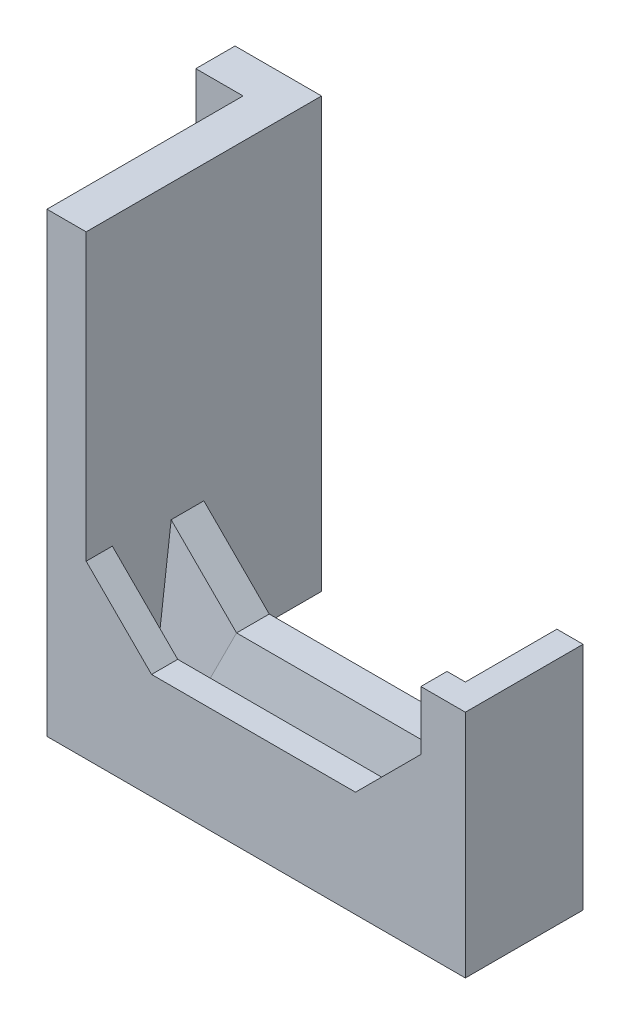
ISO-10303-21;
HEADER;
FILE_DESCRIPTION(('STEP AP214'),'2;1');
FILE_NAME('part.step','',(''),(''),'','','');
FILE_SCHEMA(('AUTOMOTIVE_DESIGN { 1 0 10303 214 1 1 1 1 }'));
ENDSEC;
DATA;
#1=APPLICATION_CONTEXT('core data for automotive mechanical design processes');
#2=APPLICATION_PROTOCOL_DEFINITION('international standard','automotive_design',2000,#1);
#3=PRODUCT_CONTEXT('',#1,'mechanical');
#4=PRODUCT('Part','Part','',(#3));
#5=PRODUCT_RELATED_PRODUCT_CATEGORY('part','',(#4));
#6=PRODUCT_DEFINITION_FORMATION('','',#4);
#7=PRODUCT_DEFINITION_CONTEXT('part definition',#1,'design');
#8=PRODUCT_DEFINITION('design','',#6,#7);
#9=PRODUCT_DEFINITION_SHAPE('','',#8);
#10=(LENGTH_UNIT() NAMED_UNIT(*) SI_UNIT(.MILLI.,.METRE.));
#11=(NAMED_UNIT(*) PLANE_ANGLE_UNIT() SI_UNIT($,.RADIAN.));
#12=(NAMED_UNIT(*) SI_UNIT($,.STERADIAN.) SOLID_ANGLE_UNIT());
#13=UNCERTAINTY_MEASURE_WITH_UNIT(LENGTH_MEASURE(1.E-05),#10,'distance_accuracy_value','');
#14=(GEOMETRIC_REPRESENTATION_CONTEXT(3) GLOBAL_UNCERTAINTY_ASSIGNED_CONTEXT((#13)) GLOBAL_UNIT_ASSIGNED_CONTEXT((#10,
#11,#12)) REPRESENTATION_CONTEXT('',''));
#15=CARTESIAN_POINT('',(0.,0.,0.));
#16=DIRECTION('',(0.,0.,1.));
#17=DIRECTION('',(1.,0.,0.));
#18=AXIS2_PLACEMENT_3D('',#15,#16,#17);
#19=CARTESIAN_POINT('',(13.8973299123179,86.3847199439034,18.));
#20=DIRECTION('',(0.,-1.,0.));
#21=DIRECTION('',(1.,0.,0.));
#22=AXIS2_PLACEMENT_3D('',#19,#20,#21);
#23=PLANE('',#22);
#24=DIRECTION('',(-1.,0.,0.));
#25=VECTOR('',#24,1.);
#26=CARTESIAN_POINT('',(13.8973299123179,86.3847199439034,18.));
#27=LINE('',#26,#25);
#28=CARTESIAN_POINT('',(5.49412361691209,86.3847199439034,18.));
#29=VERTEX_POINT('',#28);
#30=CARTESIAN_POINT('',(-10.1026700876821,86.3847199439034,18.));
#31=VERTEX_POINT('',#30);
#32=EDGE_CURVE('E280',#29,#31,#27,.T.);
#33=ORIENTED_EDGE('',*,*,#32,.F.);
#34=DIRECTION('',(0.,0.,-1.));
#35=VECTOR('',#34,1.);
#36=CARTESIAN_POINT('',(5.49412361691209,86.3847199439034,16.));
#37=LINE('',#36,#35);
#38=CARTESIAN_POINT('',(5.49412361691209,86.3847199439034,16.));
#39=VERTEX_POINT('',#38);
#40=EDGE_CURVE('E405',#29,#39,#37,.T.);
#41=ORIENTED_EDGE('',*,*,#40,.T.);
#42=DIRECTION('',(-1.,0.,0.));
#43=VECTOR('',#42,1.);
#44=CARTESIAN_POINT('',(13.8973299123179,86.3847199439034,16.));
#45=LINE('',#44,#43);
#46=CARTESIAN_POINT('',(-10.1026700876821,86.3847199439034,16.));
#47=VERTEX_POINT('',#46);
#48=EDGE_CURVE('E283',#39,#47,#45,.T.);
#49=ORIENTED_EDGE('',*,*,#48,.T.);
#50=DIRECTION('',(0.,0.,1.));
#51=VECTOR('',#50,1.);
#52=CARTESIAN_POINT('',(-10.1026700876821,86.3847199439034,18.));
#53=LINE('',#52,#51);
#54=EDGE_CURVE('E383',#47,#31,#53,.T.);
#55=ORIENTED_EDGE('',*,*,#54,.T.);
#56=EDGE_LOOP('',(#33,#41,#49,#55));
#57=FACE_BOUND('',#56,.T.);
#58=ADVANCED_FACE('F36',(#57),#23,.F.);
#59=CARTESIAN_POINT('',(-15.1026700876821,80.3847199439034,3.));
#60=DIRECTION('',(-1.,0.,0.));
#61=DIRECTION('',(0.,-1.,0.));
#62=AXIS2_PLACEMENT_3D('',#59,#60,#61);
#63=PLANE('',#62);
#64=DIRECTION('',(0.,0.,-1.));
#65=VECTOR('',#64,1.);
#66=CARTESIAN_POINT('',(-15.1026700876821,80.3847199439034,3.));
#67=LINE('',#66,#65);
#68=CARTESIAN_POINT('',(-15.1026700876821,80.3847199439033,16.));
#69=VERTEX_POINT('',#68);
#70=CARTESIAN_POINT('',(-15.1026700876821,80.3847199439033,12.8091610395335));
#71=VERTEX_POINT('',#70);
#72=EDGE_CURVE('E375',#69,#71,#67,.T.);
#73=ORIENTED_EDGE('',*,*,#72,.T.);
#74=DIRECTION('',(0.,0.992316665359131,-0.123724030206482));
#75=VECTOR('',#74,1.);
#76=CARTESIAN_POINT('',(-15.1026700876821,81.5890241634079,12.6590059763029));
#77=LINE('',#76,#75);
#78=CARTESIAN_POINT('',(-15.1026700876821,90.8847199439033,11.4999999999999));
#79=VERTEX_POINT('',#78);
#80=EDGE_CURVE('E425',#71,#79,#77,.T.);
#81=ORIENTED_EDGE('',*,*,#80,.T.);
#82=DIRECTION('',(0.,0.,-1.));
#83=VECTOR('',#82,1.);
#84=CARTESIAN_POINT('',(-15.1026700876821,90.8847199439033,8.99999999999998));
#85=LINE('',#84,#83);
#86=CARTESIAN_POINT('',(-15.1026700876821,90.8847199439033,8.99999999999998));
#87=VERTEX_POINT('',#86);
#88=EDGE_CURVE('E397',#79,#87,#85,.T.);
#89=ORIENTED_EDGE('',*,*,#88,.T.);
#90=DIRECTION('',(0.,-1.,0.));
#91=VECTOR('',#90,1.);
#92=CARTESIAN_POINT('',(-15.1026700876821,85.8847199439034,8.99999999999998));
#93=LINE('',#92,#91);
#94=CARTESIAN_POINT('',(-15.1026700876821,80.3847199439033,8.99999999999998));
#95=VERTEX_POINT('',#94);
#96=EDGE_CURVE('E261',#87,#95,#93,.T.);
#97=ORIENTED_EDGE('',*,*,#96,.T.);
#98=CARTESIAN_POINT('',(-15.1026700876821,80.3847199439034,0.));
#99=VERTEX_POINT('',#98);
#100=EDGE_CURVE('E374',#95,#99,#67,.T.);
#101=ORIENTED_EDGE('',*,*,#100,.T.);
#102=DIRECTION('',(0.,1.,0.));
#103=VECTOR('',#102,1.);
#104=CARTESIAN_POINT('',(-15.1026700876821,80.3847199439034,0.));
#105=LINE('',#104,#103);
#106=CARTESIAN_POINT('',(-15.1026700876821,113.200215401418,0.));
#107=VERTEX_POINT('',#106);
#108=EDGE_CURVE('E340',#99,#107,#105,.T.);
#109=ORIENTED_EDGE('',*,*,#108,.T.);
#110=DIRECTION('',(0.,0.,-1.));
#111=VECTOR('',#110,1.);
#112=CARTESIAN_POINT('',(-15.1026700876821,113.200215401418,3.));
#113=LINE('',#112,#111);
#114=CARTESIAN_POINT('',(-15.1026700876821,113.200215401418,18.));
#115=VERTEX_POINT('',#114);
#116=EDGE_CURVE('E371',#115,#107,#113,.T.);
#117=ORIENTED_EDGE('',*,*,#116,.F.);
#118=DIRECTION('',(0.,1.,0.));
#119=VECTOR('',#118,1.);
#120=CARTESIAN_POINT('',(-15.1026700876821,113.200215401418,18.));
#121=LINE('',#120,#119);
#122=CARTESIAN_POINT('',(-15.1026700876821,91.3847199439034,18.));
#123=VERTEX_POINT('',#122);
#124=EDGE_CURVE('E286',#123,#115,#121,.T.);
#125=ORIENTED_EDGE('',*,*,#124,.F.);
#126=DIRECTION('',(0.,0.,-1.));
#127=VECTOR('',#126,1.);
#128=CARTESIAN_POINT('',(-15.1026700876821,91.3847199439034,16.));
#129=LINE('',#128,#127);
#130=CARTESIAN_POINT('',(-15.1026700876821,91.3847199439034,16.));
#131=VERTEX_POINT('',#130);
#132=EDGE_CURVE('E386',#123,#131,#129,.T.);
#133=ORIENTED_EDGE('',*,*,#132,.T.);
#134=DIRECTION('',(0.,1.,0.));
#135=VECTOR('',#134,1.);
#136=CARTESIAN_POINT('',(-15.1026700876821,80.3847199439034,16.));
#137=LINE('',#136,#135);
#138=EDGE_CURVE('E277',#69,#131,#137,.T.);
#139=ORIENTED_EDGE('',*,*,#138,.F.);
#140=EDGE_LOOP('',(#73,#81,#89,#97,#101,#109,#117,#125,#133,#139));
#141=FACE_BOUND('',#140,.T.);
#142=ADVANCED_FACE('F456',(#141),#63,.F.);
#143=CARTESIAN_POINT('',(11.8973299123179,86.3847199439034,8.99999999999998));
#144=DIRECTION('',(1.,0.,0.));
#145=DIRECTION('',(0.,0.,-1.));
#146=AXIS2_PLACEMENT_3D('',#143,#144,#145);
#147=PLANE('',#146);
#148=DIRECTION('',(0.,1.,0.));
#149=VECTOR('',#148,1.);
#150=CARTESIAN_POINT('',(11.8973299123179,86.3847199439034,8.99999999999998));
#151=LINE('',#150,#149);
#152=CARTESIAN_POINT('',(11.8973299123179,88.8847199439033,8.99999999999998));
#153=VERTEX_POINT('',#152);
#154=CARTESIAN_POINT('',(11.8973299123179,95.8847199439033,8.99999999999998));
#155=VERTEX_POINT('',#154);
#156=EDGE_CURVE('E226',#153,#155,#151,.T.);
#157=ORIENTED_EDGE('',*,*,#156,.F.);
#158=DIRECTION('',(0.,0.,1.));
#159=VECTOR('',#158,1.);
#160=CARTESIAN_POINT('',(11.8973299123179,88.8847199439033,13.5));
#161=LINE('',#160,#159);
#162=CARTESIAN_POINT('',(11.8973299123179,88.8847199439033,11.4999999999999));
#163=VERTEX_POINT('',#162);
#164=EDGE_CURVE('E413',#153,#163,#161,.T.);
#165=ORIENTED_EDGE('',*,*,#164,.T.);
#166=DIRECTION('',(0.,-0.992316665359131,0.123724030206482));
#167=VECTOR('',#166,1.);
#168=CARTESIAN_POINT('',(11.8973299123179,86.7299225757279,11.7686644535718));
#169=LINE('',#168,#167);
#170=CARTESIAN_POINT('',(11.8973299123179,80.3847199439033,12.5597970320033));
#171=VERTEX_POINT('',#170);
#172=EDGE_CURVE('E47',#163,#171,#169,.T.);
#173=ORIENTED_EDGE('',*,*,#172,.T.);
#174=DIRECTION('',(0.,0.,1.));
#175=VECTOR('',#174,1.);
#176=CARTESIAN_POINT('',(11.8973299123179,80.3847199439033,8.99999999999998));
#177=LINE('',#176,#175);
#178=CARTESIAN_POINT('',(11.8973299123179,80.3847199439033,16.));
#179=VERTEX_POINT('',#178);
#180=EDGE_CURVE('E53',#171,#179,#177,.T.);
#181=ORIENTED_EDGE('',*,*,#180,.T.);
#182=DIRECTION('',(0.,1.,0.));
#183=VECTOR('',#182,1.);
#184=CARTESIAN_POINT('',(11.8973299123179,86.3847199439034,16.));
#185=LINE('',#184,#183);
#186=CARTESIAN_POINT('',(11.8973299123179,95.8847199439033,16.));
#187=VERTEX_POINT('',#186);
#188=EDGE_CURVE('E227',#179,#187,#185,.T.);
#189=ORIENTED_EDGE('',*,*,#188,.T.);
#190=DIRECTION('',(0.,0.,1.));
#191=VECTOR('',#190,1.);
#192=CARTESIAN_POINT('',(11.8973299123179,95.8847199439033,8.99999999999998));
#193=LINE('',#192,#191);
#194=EDGE_CURVE('E237',#155,#187,#193,.T.);
#195=ORIENTED_EDGE('',*,*,#194,.F.);
#196=EDGE_LOOP('',(#157,#165,#173,#181,#189,#195));
#197=FACE_BOUND('',#196,.T.);
#198=ADVANCED_FACE('F468',(#197),#147,.F.);
#199=CARTESIAN_POINT('',(13.8973299123179,80.3847199439033,8.99999999999998));
#200=DIRECTION('',(0.,-1.,0.));
#201=DIRECTION('',(0.,0.,-1.));
#202=AXIS2_PLACEMENT_3D('',#199,#200,#201);
#203=PLANE('',#202);
#204=ORIENTED_EDGE('',*,*,#180,.F.);
#205=DIRECTION('',(-0.992316665359131,0.,-0.12372403020648));
#206=VECTOR('',#205,1.);
#207=CARTESIAN_POINT('',(13.4296661952891,80.3847199439033,12.7508517902061));
#208=LINE('',#207,#206);
#209=CARTESIAN_POINT('',(11.1755045053699,80.3847199439033,12.4697983938964));
#210=VERTEX_POINT('',#209);
#211=EDGE_CURVE('E11',#171,#210,#208,.T.);
#212=ORIENTED_EDGE('',*,*,#211,.T.);
#213=DIRECTION('',(1.,0.,0.));
#214=VECTOR('',#213,1.);
#215=CARTESIAN_POINT('',(13.8973299123179,80.3847199439033,12.4697983938964));
#216=LINE('',#215,#214);
#217=CARTESIAN_POINT('',(-12.3808446807341,80.3847199439033,12.4697983938965));
#218=VERTEX_POINT('',#217);
#219=EDGE_CURVE('E430',#210,#218,#216,.F.);
#220=ORIENTED_EDGE('',*,*,#219,.T.);
#221=DIRECTION('',(-0.992316665359131,0.,0.123724030206481));
#222=VECTOR('',#221,1.);
#223=CARTESIAN_POINT('',(13.9210721954812,80.3847199439033,9.19042269490677));
#224=LINE('',#223,#222);
#225=EDGE_CURVE('E427',#218,#71,#224,.T.);
#226=ORIENTED_EDGE('',*,*,#225,.T.);
#227=ORIENTED_EDGE('',*,*,#72,.F.);
#228=DIRECTION('',(1.,0.,0.));
#229=VECTOR('',#228,1.);
#230=CARTESIAN_POINT('',(13.8973299123179,80.3847199439033,16.));
#231=LINE('',#230,#229);
#232=EDGE_CURVE('E263',#69,#179,#231,.T.);
#233=ORIENTED_EDGE('',*,*,#232,.T.);
#234=EDGE_LOOP('',(#204,#212,#220,#226,#227,#233));
#235=FACE_BOUND('',#234,.T.);
#236=ADVANCED_FACE('F459',(#235),#203,.F.);
#237=CARTESIAN_POINT('',(-22.3449721572885,75.3032487766021,3.));
#238=DIRECTION('',(-0.574361670342173,0.81860165626619,0.));
#239=DIRECTION('',(-0.81860165626619,-0.574361670342173,0.));
#240=AXIS2_PLACEMENT_3D('',#237,#238,#239);
#241=PLANE('',#240);
#242=DIRECTION('',(0.81860165626619,0.574361670342173,0.));
#243=VECTOR('',#242,1.);
#244=CARTESIAN_POINT('',(-22.3449721572885,75.3032487766021,8.99999999999998));
#245=LINE('',#244,#243);
#246=CARTESIAN_POINT('',(-18.1026700876821,78.2798072579386,8.99999999999998));
#247=VERTEX_POINT('',#246);
#248=EDGE_CURVE('E266',#247,#95,#245,.T.);
#249=ORIENTED_EDGE('',*,*,#248,.F.);
#250=DIRECTION('',(0.,0.,-1.));
#251=VECTOR('',#250,1.);
#252=CARTESIAN_POINT('',(-18.1026700876821,78.2798072579386,18.));
#253=LINE('',#252,#251);
#254=CARTESIAN_POINT('',(-18.1026700876821,78.2798072579386,3.));
#255=VERTEX_POINT('',#254);
#256=EDGE_CURVE('E292',#247,#255,#253,.T.);
#257=ORIENTED_EDGE('',*,*,#256,.T.);
#258=DIRECTION('',(0.81860165626619,0.574361670342173,0.));
#259=VECTOR('',#258,1.);
#260=CARTESIAN_POINT('',(-22.3449721572885,75.3032487766021,3.));
#261=LINE('',#260,#259);
#262=CARTESIAN_POINT('',(-22.3449721572885,75.3032487766021,3.));
#263=VERTEX_POINT('',#262);
#264=EDGE_CURVE('E318',#263,#255,#261,.T.);
#265=ORIENTED_EDGE('',*,*,#264,.F.);
#266=DIRECTION('',(0.,0.,-1.));
#267=VECTOR('',#266,1.);
#268=CARTESIAN_POINT('',(-22.3449721572885,75.3032487766021,3.));
#269=LINE('',#268,#267);
#270=CARTESIAN_POINT('',(-22.3449721572885,75.3032487766021,0.));
#271=VERTEX_POINT('',#270);
#272=EDGE_CURVE('E377',#263,#271,#269,.T.);
#273=ORIENTED_EDGE('',*,*,#272,.T.);
#274=DIRECTION('',(0.81860165626619,0.574361670342173,0.));
#275=VECTOR('',#274,1.);
#276=CARTESIAN_POINT('',(-22.3449721572885,75.3032487766021,0.));
#277=LINE('',#276,#275);
#278=EDGE_CURVE('E337',#271,#99,#277,.T.);
#279=ORIENTED_EDGE('',*,*,#278,.T.);
#280=ORIENTED_EDGE('',*,*,#100,.F.);
#281=EDGE_LOOP('',(#249,#257,#265,#273,#279,#280));
#282=FACE_BOUND('',#281,.T.);
#283=ADVANCED_FACE('F489',(#282),#241,.F.);
#284=CARTESIAN_POINT('',(13.8973299123179,80.3847199439033,16.));
#285=DIRECTION('',(0.,0.,1.));
#286=DIRECTION('',(1.,0.,0.));
#287=AXIS2_PLACEMENT_3D('',#284,#285,#286);
#288=PLANE('',#287);
#289=ORIENTED_EDGE('',*,*,#232,.F.);
#290=ORIENTED_EDGE('',*,*,#138,.T.);
#291=DIRECTION('',(-0.70710678118655,0.707106781186545,0.));
#292=VECTOR('',#291,1.);
#293=CARTESIAN_POINT('',(4.897329912318,71.3847199439034,16.));
#294=LINE('',#293,#292);
#295=EDGE_CURVE('E391',#131,#47,#294,.F.);
#296=ORIENTED_EDGE('',*,*,#295,.T.);
#297=ORIENTED_EDGE('',*,*,#48,.F.);
#298=DIRECTION('',(-0.707106781186545,-0.70710678118655,0.));
#299=VECTOR('',#298,1.);
#300=CARTESIAN_POINT('',(6.69572676461494,87.5863230916062,16.));
#301=LINE('',#300,#299);
#302=CARTESIAN_POINT('',(10.4941236169121,91.3847199439034,16.));
#303=VERTEX_POINT('',#302);
#304=EDGE_CURVE('E409',#39,#303,#301,.F.);
#305=ORIENTED_EDGE('',*,*,#304,.T.);
#306=DIRECTION('',(0.,-1.,0.));
#307=VECTOR('',#306,1.);
#308=CARTESIAN_POINT('',(10.4941236169121,95.8847199439033,16.));
#309=LINE('',#308,#307);
#310=CARTESIAN_POINT('',(10.4941236169121,95.8847199439033,16.));
#311=VERTEX_POINT('',#310);
#312=EDGE_CURVE('E256',#311,#303,#309,.T.);
#313=ORIENTED_EDGE('',*,*,#312,.F.);
#314=DIRECTION('',(-1.,0.,0.));
#315=VECTOR('',#314,1.);
#316=CARTESIAN_POINT('',(10.4941236169121,95.8847199439033,16.));
#317=LINE('',#316,#315);
#318=EDGE_CURVE('E248',#187,#311,#317,.T.);
#319=ORIENTED_EDGE('',*,*,#318,.F.);
#320=ORIENTED_EDGE('',*,*,#188,.F.);
#321=EDGE_LOOP('',(#289,#290,#296,#297,#305,#313,#319,#320));
#322=FACE_BOUND('',#321,.T.);
#323=ADVANCED_FACE('F473',(#322),#288,.F.);
#324=CARTESIAN_POINT('',(-25.7628879169966,78.9526119894845,3.));
#325=DIRECTION('',(0.,0.,1.));
#326=DIRECTION('',(1.,0.,0.));
#327=AXIS2_PLACEMENT_3D('',#324,#325,#326);
#328=PLANE('',#327);
#329=DIRECTION('',(0.,-1.,0.));
#330=VECTOR('',#329,1.);
#331=CARTESIAN_POINT('',(-18.1026700876821,80.3847199439034,3.));
#332=LINE('',#331,#330);
#333=CARTESIAN_POINT('',(-18.1026700876821,113.200215401418,3.));
#334=VERTEX_POINT('',#333);
#335=EDGE_CURVE('E285',#334,#255,#332,.T.);
#336=ORIENTED_EDGE('',*,*,#335,.F.);
#337=DIRECTION('',(-1.,0.,0.));
#338=VECTOR('',#337,1.);
#339=CARTESIAN_POINT('',(-15.1026700876821,113.200215401418,3.));
#340=LINE('',#339,#338);
#341=CARTESIAN_POINT('',(-21.7189991465302,113.200215401418,3.));
#342=VERTEX_POINT('',#341);
#343=EDGE_CURVE('E321',#334,#342,#340,.T.);
#344=ORIENTED_EDGE('',*,*,#343,.T.);
#345=DIRECTION('',(0.,-1.,0.));
#346=VECTOR('',#345,1.);
#347=CARTESIAN_POINT('',(-21.7189991465302,113.200215401418,3.));
#348=LINE('',#347,#346);
#349=CARTESIAN_POINT('',(-21.7189991465302,103.843357559284,3.));
#350=VERTEX_POINT('',#349);
#351=EDGE_CURVE('E323',#342,#350,#348,.T.);
#352=ORIENTED_EDGE('',*,*,#351,.T.);
#353=CARTESIAN_POINT('',(-25.7628879169966,103.843357559284,3.));
#354=DIRECTION('',(0.,0.,-1.));
#355=DIRECTION('',(-1.,0.,0.));
#356=AXIS2_PLACEMENT_3D('',#353,#354,#355);
#357=CIRCLE('',#356,4.04388877046631);
#358=CARTESIAN_POINT('',(-25.7628879169966,99.7994687888175,3.));
#359=VERTEX_POINT('',#358);
#360=EDGE_CURVE('E325',#350,#359,#357,.T.);
#361=ORIENTED_EDGE('',*,*,#360,.T.);
#362=DIRECTION('',(-1.,0.,0.));
#363=VECTOR('',#362,1.);
#364=CARTESIAN_POINT('',(-25.7628879169966,99.7994687888175,3.));
#365=LINE('',#364,#363);
#366=CARTESIAN_POINT('',(-29.1744826102425,99.7994687888175,3.));
#367=VERTEX_POINT('',#366);
#368=EDGE_CURVE('E327',#359,#367,#365,.T.);
#369=ORIENTED_EDGE('',*,*,#368,.T.);
#370=DIRECTION('',(0.,-1.,0.));
#371=VECTOR('',#370,1.);
#372=CARTESIAN_POINT('',(-29.1744826102425,99.7994687888175,3.));
#373=LINE('',#372,#371);
#374=CARTESIAN_POINT('',(-29.1744826102425,97.1022234577408,3.));
#375=VERTEX_POINT('',#374);
#376=EDGE_CURVE('E329',#367,#375,#373,.T.);
#377=ORIENTED_EDGE('',*,*,#376,.T.);
#378=DIRECTION('',(-1.,0.,0.));
#379=VECTOR('',#378,1.);
#380=CARTESIAN_POINT('',(-29.1744826102425,97.1022234577408,3.));
#381=LINE('',#380,#379);
#382=CARTESIAN_POINT('',(-30.7628879169966,97.1022234577408,3.));
#383=VERTEX_POINT('',#382);
#384=EDGE_CURVE('E331',#375,#383,#381,.T.);
#385=ORIENTED_EDGE('',*,*,#384,.T.);
#386=DIRECTION('',(0.,-1.,0.));
#387=VECTOR('',#386,1.);
#388=CARTESIAN_POINT('',(-30.7628879169966,97.1022234577408,3.));
#389=LINE('',#388,#387);
#390=CARTESIAN_POINT('',(-30.7628879169966,78.9526119894845,3.));
#391=VERTEX_POINT('',#390);
#392=EDGE_CURVE('E313',#383,#391,#389,.T.);
#393=ORIENTED_EDGE('',*,*,#392,.T.);
#394=CARTESIAN_POINT('',(-25.7628879169966,78.9526119894845,3.));
#395=DIRECTION('',(0.,0.,1.));
#396=DIRECTION('',(1.,0.,0.));
#397=AXIS2_PLACEMENT_3D('',#394,#395,#396);
#398=CIRCLE('',#397,5.);
#399=EDGE_CURVE('E315',#391,#263,#398,.T.);
#400=ORIENTED_EDGE('',*,*,#399,.T.);
#401=ORIENTED_EDGE('',*,*,#264,.T.);
#402=EDGE_LOOP('',(#336,#344,#352,#361,#369,#377,#385,#393,#400,#401));
#403=FACE_BOUND('',#402,.T.);
#404=CARTESIAN_POINT('',(-25.7628879169966,88.9526119894845,3.));
#405=DIRECTION('',(0.,0.,1.));
#406=DIRECTION('',(1.,0.,0.));
#407=AXIS2_PLACEMENT_3D('',#404,#405,#406);
#408=CIRCLE('',#407,1.99999999999999);
#409=CARTESIAN_POINT('',(-23.7628879169966,88.9526119894845,3.));
#410=VERTEX_POINT('',#409);
#411=EDGE_CURVE('E307',#410,#410,#408,.T.);
#412=ORIENTED_EDGE('',*,*,#411,.F.);
#413=EDGE_LOOP('',(#412));
#414=FACE_BOUND('',#413,.T.);
#415=CARTESIAN_POINT('',(-25.7628879169966,78.9526119894845,3.));
#416=DIRECTION('',(0.,0.,1.));
#417=DIRECTION('',(1.,0.,0.));
#418=AXIS2_PLACEMENT_3D('',#415,#416,#417);
#419=CIRCLE('',#418,2.);
#420=CARTESIAN_POINT('',(-23.7628879169966,78.9526119894845,3.));
#421=VERTEX_POINT('',#420);
#422=EDGE_CURVE('E301',#421,#421,#419,.T.);
#423=ORIENTED_EDGE('',*,*,#422,.F.);
#424=EDGE_LOOP('',(#423));
#425=FACE_BOUND('',#424,.T.);
#426=ADVANCED_FACE('F497',(#403,#414,#425),#328,.T.);
#427=CARTESIAN_POINT('',(-25.7628879169966,78.9526119894845,0.));
#428=DIRECTION('',(0.,0.,1.));
#429=DIRECTION('',(1.,0.,0.));
#430=AXIS2_PLACEMENT_3D('',#427,#428,#429);
#431=PLANE('',#430);
#432=DIRECTION('',(0.,-1.,0.));
#433=VECTOR('',#432,1.);
#434=CARTESIAN_POINT('',(-30.7628879169966,88.9526119894845,0.));
#435=LINE('',#434,#433);
#436=CARTESIAN_POINT('',(-30.7628879169966,97.1022234577408,0.));
#437=VERTEX_POINT('',#436);
#438=CARTESIAN_POINT('',(-30.7628879169966,78.9526119894845,0.));
#439=VERTEX_POINT('',#438);
#440=EDGE_CURVE('E310',#437,#439,#435,.T.);
#441=ORIENTED_EDGE('',*,*,#440,.F.);
#442=DIRECTION('',(-1.,0.,0.));
#443=VECTOR('',#442,1.);
#444=CARTESIAN_POINT('',(-29.1744826102425,97.1022234577408,0.));
#445=LINE('',#444,#443);
#446=CARTESIAN_POINT('',(-29.1744826102425,97.1022234577408,0.));
#447=VERTEX_POINT('',#446);
#448=EDGE_CURVE('E316',#447,#437,#445,.T.);
#449=ORIENTED_EDGE('',*,*,#448,.F.);
#450=DIRECTION('',(0.,-1.,0.));
#451=VECTOR('',#450,1.);
#452=CARTESIAN_POINT('',(-29.1744826102425,99.7994687888175,0.));
#453=LINE('',#452,#451);
#454=CARTESIAN_POINT('',(-29.1744826102425,99.7994687888175,0.));
#455=VERTEX_POINT('',#454);
#456=EDGE_CURVE('E350',#455,#447,#453,.T.);
#457=ORIENTED_EDGE('',*,*,#456,.F.);
#458=DIRECTION('',(-1.,0.,0.));
#459=VECTOR('',#458,1.);
#460=CARTESIAN_POINT('',(-25.7628879169966,99.7994687888175,0.));
#461=LINE('',#460,#459);
#462=CARTESIAN_POINT('',(-25.7628879169966,99.7994687888175,0.));
#463=VERTEX_POINT('',#462);
#464=EDGE_CURVE('E348',#463,#455,#461,.T.);
#465=ORIENTED_EDGE('',*,*,#464,.F.);
#466=CARTESIAN_POINT('',(-25.7628879169966,103.843357559284,0.));
#467=DIRECTION('',(0.,0.,-1.));
#468=DIRECTION('',(-1.,0.,0.));
#469=AXIS2_PLACEMENT_3D('',#466,#467,#468);
#470=CIRCLE('',#469,4.04388877046631);
#471=CARTESIAN_POINT('',(-21.7189991465302,103.843357559284,0.));
#472=VERTEX_POINT('',#471);
#473=EDGE_CURVE('E346',#472,#463,#470,.T.);
#474=ORIENTED_EDGE('',*,*,#473,.F.);
#475=DIRECTION('',(0.,-1.,0.));
#476=VECTOR('',#475,1.);
#477=CARTESIAN_POINT('',(-21.7189991465302,113.200215401418,0.));
#478=LINE('',#477,#476);
#479=CARTESIAN_POINT('',(-21.7189991465302,113.200215401418,0.));
#480=VERTEX_POINT('',#479);
#481=EDGE_CURVE('E344',#480,#472,#478,.T.);
#482=ORIENTED_EDGE('',*,*,#481,.F.);
#483=DIRECTION('',(-1.,0.,0.));
#484=VECTOR('',#483,1.);
#485=CARTESIAN_POINT('',(-15.1026700876821,113.200215401418,0.));
#486=LINE('',#485,#484);
#487=EDGE_CURVE('E342',#107,#480,#486,.T.);
#488=ORIENTED_EDGE('',*,*,#487,.F.);
#489=ORIENTED_EDGE('',*,*,#108,.F.);
#490=ORIENTED_EDGE('',*,*,#278,.F.);
#491=CARTESIAN_POINT('',(-25.7628879169966,78.9526119894845,0.));
#492=DIRECTION('',(0.,0.,1.));
#493=DIRECTION('',(1.,0.,0.));
#494=AXIS2_PLACEMENT_3D('',#491,#492,#493);
#495=CIRCLE('',#494,5.);
#496=EDGE_CURVE('E335',#439,#271,#495,.T.);
#497=ORIENTED_EDGE('',*,*,#496,.F.);
#498=EDGE_LOOP('',(#441,#449,#457,#465,#474,#482,#488,#489,#490,#497));
#499=FACE_BOUND('',#498,.T.);
#500=CARTESIAN_POINT('',(-25.7628879169966,88.9526119894845,0.));
#501=DIRECTION('',(0.,0.,1.));
#502=DIRECTION('',(1.,0.,0.));
#503=AXIS2_PLACEMENT_3D('',#500,#501,#502);
#504=CIRCLE('',#503,1.99999999999999);
#505=CARTESIAN_POINT('',(-23.7628879169966,88.9526119894845,0.));
#506=VERTEX_POINT('',#505);
#507=EDGE_CURVE('E304',#506,#506,#504,.T.);
#508=ORIENTED_EDGE('',*,*,#507,.T.);
#509=EDGE_LOOP('',(#508));
#510=FACE_BOUND('',#509,.T.);
#511=CARTESIAN_POINT('',(-25.7628879169966,78.9526119894845,0.));
#512=DIRECTION('',(0.,0.,1.));
#513=DIRECTION('',(1.,0.,0.));
#514=AXIS2_PLACEMENT_3D('',#511,#512,#513);
#515=CIRCLE('',#514,2.);
#516=CARTESIAN_POINT('',(-23.7628879169966,78.9526119894845,0.));
#517=VERTEX_POINT('',#516);
#518=EDGE_CURVE('E300',#517,#517,#515,.T.);
#519=ORIENTED_EDGE('',*,*,#518,.T.);
#520=EDGE_LOOP('',(#519));
#521=FACE_BOUND('',#520,.T.);
#522=ADVANCED_FACE('F541',(#499,#510,#521),#431,.F.);
#523=CARTESIAN_POINT('',(-30.7628879169966,88.9526119894845,3.));
#524=DIRECTION('',(1.,0.,0.));
#525=DIRECTION('',(0.,0.,-1.));
#526=AXIS2_PLACEMENT_3D('',#523,#524,#525);
#527=PLANE('',#526);
#528=ORIENTED_EDGE('',*,*,#440,.T.);
#529=DIRECTION('',(0.,0.,-1.));
#530=VECTOR('',#529,1.);
#531=CARTESIAN_POINT('',(-30.7628879169966,78.9526119894845,3.));
#532=LINE('',#531,#530);
#533=EDGE_CURVE('E380',#391,#439,#532,.T.);
#534=ORIENTED_EDGE('',*,*,#533,.F.);
#535=ORIENTED_EDGE('',*,*,#392,.F.);
#536=DIRECTION('',(0.,0.,-1.));
#537=VECTOR('',#536,1.);
#538=CARTESIAN_POINT('',(-30.7628879169966,97.1022234577408,3.));
#539=LINE('',#538,#537);
#540=EDGE_CURVE('E333',#383,#437,#539,.T.);
#541=ORIENTED_EDGE('',*,*,#540,.T.);
#542=EDGE_LOOP('',(#528,#534,#535,#541));
#543=FACE_BOUND('',#542,.T.);
#544=ADVANCED_FACE('F532',(#543),#527,.F.);
#545=CARTESIAN_POINT('',(-25.7628879169966,78.9526119894845,3.));
#546=DIRECTION('',(0.,0.,-1.));
#547=DIRECTION('',(-1.,0.,0.));
#548=AXIS2_PLACEMENT_3D('',#545,#546,#547);
#549=CYLINDRICAL_SURFACE('',#548,5.);
#550=ORIENTED_EDGE('',*,*,#496,.T.);
#551=ORIENTED_EDGE('',*,*,#272,.F.);
#552=ORIENTED_EDGE('',*,*,#399,.F.);
#553=ORIENTED_EDGE('',*,*,#533,.T.);
#554=EDGE_LOOP('',(#550,#551,#552,#553));
#555=FACE_BOUND('',#554,.T.);
#556=ADVANCED_FACE('F537',(#555),#549,.T.);
#557=CARTESIAN_POINT('',(-15.1026700876821,113.200215401418,3.));
#558=DIRECTION('',(0.,-1.,0.));
#559=DIRECTION('',(0.,0.,-1.));
#560=AXIS2_PLACEMENT_3D('',#557,#558,#559);
#561=PLANE('',#560);
#562=ORIENTED_EDGE('',*,*,#487,.T.);
#563=DIRECTION('',(0.,0.,-1.));
#564=VECTOR('',#563,1.);
#565=CARTESIAN_POINT('',(-21.7189991465302,113.200215401418,3.));
#566=LINE('',#565,#564);
#567=EDGE_CURVE('E368',#342,#480,#566,.T.);
#568=ORIENTED_EDGE('',*,*,#567,.F.);
#569=ORIENTED_EDGE('',*,*,#343,.F.);
#570=DIRECTION('',(0.,0.,-1.));
#571=VECTOR('',#570,1.);
#572=CARTESIAN_POINT('',(-18.1026700876821,113.200215401418,18.));
#573=LINE('',#572,#571);
#574=CARTESIAN_POINT('',(-18.1026700876821,113.200215401418,18.));
#575=VERTEX_POINT('',#574);
#576=EDGE_CURVE('E297',#575,#334,#573,.T.);
#577=ORIENTED_EDGE('',*,*,#576,.F.);
#578=DIRECTION('',(-1.,0.,0.));
#579=VECTOR('',#578,1.);
#580=CARTESIAN_POINT('',(-15.1026700876821,113.200215401418,18.));
#581=LINE('',#580,#579);
#582=EDGE_CURVE('E288',#115,#575,#581,.T.);
#583=ORIENTED_EDGE('',*,*,#582,.F.);
#584=ORIENTED_EDGE('',*,*,#116,.T.);
#585=EDGE_LOOP('',(#562,#568,#569,#577,#583,#584));
#586=FACE_BOUND('',#585,.T.);
#587=ADVANCED_FACE('F501',(#586),#561,.F.);
#588=CARTESIAN_POINT('',(-21.7189991465302,113.200215401418,3.));
#589=DIRECTION('',(1.,0.,0.));
#590=DIRECTION('',(0.,0.,-1.));
#591=AXIS2_PLACEMENT_3D('',#588,#589,#590);
#592=PLANE('',#591);
#593=ORIENTED_EDGE('',*,*,#481,.T.);
#594=DIRECTION('',(0.,0.,-1.));
#595=VECTOR('',#594,1.);
#596=CARTESIAN_POINT('',(-21.7189991465302,103.843357559284,3.));
#597=LINE('',#596,#595);
#598=EDGE_CURVE('E365',#350,#472,#597,.T.);
#599=ORIENTED_EDGE('',*,*,#598,.F.);
#600=ORIENTED_EDGE('',*,*,#351,.F.);
#601=ORIENTED_EDGE('',*,*,#567,.T.);
#602=EDGE_LOOP('',(#593,#599,#600,#601));
#603=FACE_BOUND('',#602,.T.);
#604=ADVANCED_FACE('F508',(#603),#592,.F.);
#605=CARTESIAN_POINT('',(-25.7628879169966,103.843357559284,3.));
#606=DIRECTION('',(0.,0.,-1.));
#607=DIRECTION('',(-1.,0.,0.));
#608=AXIS2_PLACEMENT_3D('',#605,#606,#607);
#609=CYLINDRICAL_SURFACE('',#608,4.04388877046631);
#610=ORIENTED_EDGE('',*,*,#473,.T.);
#611=DIRECTION('',(0.,0.,-1.));
#612=VECTOR('',#611,1.);
#613=CARTESIAN_POINT('',(-25.7628879169966,99.7994687888175,3.));
#614=LINE('',#613,#612);
#615=EDGE_CURVE('E362',#359,#463,#614,.T.);
#616=ORIENTED_EDGE('',*,*,#615,.F.);
#617=ORIENTED_EDGE('',*,*,#360,.F.);
#618=ORIENTED_EDGE('',*,*,#598,.T.);
#619=EDGE_LOOP('',(#610,#616,#617,#618));
#620=FACE_BOUND('',#619,.T.);
#621=ADVANCED_FACE('F514',(#620),#609,.F.);
#622=CARTESIAN_POINT('',(-25.7628879169966,99.7994687888175,3.));
#623=DIRECTION('',(0.,-1.,0.));
#624=DIRECTION('',(0.,0.,-1.));
#625=AXIS2_PLACEMENT_3D('',#622,#623,#624);
#626=PLANE('',#625);
#627=ORIENTED_EDGE('',*,*,#464,.T.);
#628=DIRECTION('',(0.,0.,-1.));
#629=VECTOR('',#628,1.);
#630=CARTESIAN_POINT('',(-29.1744826102425,99.7994687888175,3.));
#631=LINE('',#630,#629);
#632=EDGE_CURVE('E359',#367,#455,#631,.T.);
#633=ORIENTED_EDGE('',*,*,#632,.F.);
#634=ORIENTED_EDGE('',*,*,#368,.F.);
#635=ORIENTED_EDGE('',*,*,#615,.T.);
#636=EDGE_LOOP('',(#627,#633,#634,#635));
#637=FACE_BOUND('',#636,.T.);
#638=ADVANCED_FACE('F518',(#637),#626,.F.);
#639=CARTESIAN_POINT('',(-29.1744826102425,99.7994687888175,3.));
#640=DIRECTION('',(1.,0.,0.));
#641=DIRECTION('',(0.,0.,-1.));
#642=AXIS2_PLACEMENT_3D('',#639,#640,#641);
#643=PLANE('',#642);
#644=ORIENTED_EDGE('',*,*,#456,.T.);
#645=DIRECTION('',(0.,0.,-1.));
#646=VECTOR('',#645,1.);
#647=CARTESIAN_POINT('',(-29.1744826102425,97.1022234577408,3.));
#648=LINE('',#647,#646);
#649=EDGE_CURVE('E356',#375,#447,#648,.T.);
#650=ORIENTED_EDGE('',*,*,#649,.F.);
#651=ORIENTED_EDGE('',*,*,#376,.F.);
#652=ORIENTED_EDGE('',*,*,#632,.T.);
#653=EDGE_LOOP('',(#644,#650,#651,#652));
#654=FACE_BOUND('',#653,.T.);
#655=ADVANCED_FACE('F523',(#654),#643,.F.);
#656=CARTESIAN_POINT('',(-29.1744826102425,97.1022234577408,3.));
#657=DIRECTION('',(0.,-1.,0.));
#658=DIRECTION('',(0.,0.,-1.));
#659=AXIS2_PLACEMENT_3D('',#656,#657,#658);
#660=PLANE('',#659);
#661=ORIENTED_EDGE('',*,*,#448,.T.);
#662=ORIENTED_EDGE('',*,*,#540,.F.);
#663=ORIENTED_EDGE('',*,*,#384,.F.);
#664=ORIENTED_EDGE('',*,*,#649,.T.);
#665=EDGE_LOOP('',(#661,#662,#663,#664));
#666=FACE_BOUND('',#665,.T.);
#667=ADVANCED_FACE('F529',(#666),#660,.F.);
#668=CARTESIAN_POINT('',(-25.7628879169966,88.9526119894845,3.));
#669=DIRECTION('',(0.,0.,-1.));
#670=DIRECTION('',(-1.,0.,0.));
#671=AXIS2_PLACEMENT_3D('',#668,#669,#670);
#672=CYLINDRICAL_SURFACE('',#671,1.99999999999999);
#673=ORIENTED_EDGE('',*,*,#411,.T.);
#674=EDGE_LOOP('',(#673));
#675=FACE_BOUND('',#674,.T.);
#676=ORIENTED_EDGE('',*,*,#507,.F.);
#677=EDGE_LOOP('',(#676));
#678=FACE_BOUND('',#677,.T.);
#679=ADVANCED_FACE('F574',(#675,#678),#672,.F.);
#680=CARTESIAN_POINT('',(-25.7628879169966,78.9526119894845,3.));
#681=DIRECTION('',(0.,0.,-1.));
#682=DIRECTION('',(-1.,0.,0.));
#683=AXIS2_PLACEMENT_3D('',#680,#681,#682);
#684=CYLINDRICAL_SURFACE('',#683,2.);
#685=ORIENTED_EDGE('',*,*,#422,.T.);
#686=EDGE_LOOP('',(#685));
#687=FACE_BOUND('',#686,.T.);
#688=ORIENTED_EDGE('',*,*,#518,.F.);
#689=EDGE_LOOP('',(#688));
#690=FACE_BOUND('',#689,.T.);
#691=ADVANCED_FACE('F571',(#687,#690),#684,.F.);
#692=CARTESIAN_POINT('',(-18.1026700876821,80.3847199439034,18.));
#693=DIRECTION('',(1.,0.,0.));
#694=DIRECTION('',(0.,1.,0.));
#695=AXIS2_PLACEMENT_3D('',#692,#693,#694);
#696=PLANE('',#695);
#697=ORIENTED_EDGE('',*,*,#256,.F.);
#698=CARTESIAN_POINT('',(-18.1026700876821,78.2798072579386,18.));
#699=VERTEX_POINT('',#698);
#700=EDGE_CURVE('E295',#699,#247,#253,.T.);
#701=ORIENTED_EDGE('',*,*,#700,.F.);
#702=DIRECTION('',(0.,-1.,0.));
#703=VECTOR('',#702,1.);
#704=CARTESIAN_POINT('',(-18.1026700876821,113.200215401418,18.));
#705=LINE('',#704,#703);
#706=EDGE_CURVE('E290',#575,#699,#705,.T.);
#707=ORIENTED_EDGE('',*,*,#706,.F.);
#708=ORIENTED_EDGE('',*,*,#576,.T.);
#709=ORIENTED_EDGE('',*,*,#335,.T.);
#710=EDGE_LOOP('',(#697,#701,#707,#708,#709));
#711=FACE_BOUND('',#710,.T.);
#712=ADVANCED_FACE('F492',(#711),#696,.F.);
#713=CARTESIAN_POINT('',(0.,0.,18.));
#714=DIRECTION('',(0.,0.,-1.));
#715=DIRECTION('',(-1.,0.,0.));
#716=AXIS2_PLACEMENT_3D('',#713,#714,#715);
#717=PLANE('',#716);
#718=ORIENTED_EDGE('',*,*,#706,.T.);
#719=DIRECTION('',(1.,0.,0.));
#720=VECTOR('',#719,1.);
#721=CARTESIAN_POINT('',(-18.1026700876821,78.2798072579386,18.));
#722=LINE('',#721,#720);
#723=CARTESIAN_POINT('',(13.8973299123179,78.2798072579386,18.));
#724=VERTEX_POINT('',#723);
#725=EDGE_CURVE('E270',#699,#724,#722,.T.);
#726=ORIENTED_EDGE('',*,*,#725,.T.);
#727=DIRECTION('',(0.,-1.,0.));
#728=VECTOR('',#727,1.);
#729=CARTESIAN_POINT('',(13.8973299123179,80.3847199439033,18.));
#730=LINE('',#729,#728);
#731=CARTESIAN_POINT('',(13.8973299123179,95.8847199439033,18.));
#732=VERTEX_POINT('',#731);
#733=EDGE_CURVE('E278',#732,#724,#730,.T.);
#734=ORIENTED_EDGE('',*,*,#733,.F.);
#735=DIRECTION('',(1.,0.,0.));
#736=VECTOR('',#735,1.);
#737=CARTESIAN_POINT('',(11.8973299123179,95.8847199439033,18.));
#738=LINE('',#737,#736);
#739=CARTESIAN_POINT('',(10.4941236169121,95.8847199439033,18.));
#740=VERTEX_POINT('',#739);
#741=EDGE_CURVE('E242',#740,#732,#738,.T.);
#742=ORIENTED_EDGE('',*,*,#741,.F.);
#743=DIRECTION('',(0.,-1.,0.));
#744=VECTOR('',#743,1.);
#745=CARTESIAN_POINT('',(10.4941236169121,95.8847199439033,18.));
#746=LINE('',#745,#744);
#747=CARTESIAN_POINT('',(10.4941236169121,91.3847199439034,18.));
#748=VERTEX_POINT('',#747);
#749=EDGE_CURVE('E253',#740,#748,#746,.T.);
#750=ORIENTED_EDGE('',*,*,#749,.T.);
#751=DIRECTION('',(0.707106781186545,0.70710678118655,0.));
#752=VECTOR('',#751,1.);
#753=CARTESIAN_POINT('',(-40.4452981634956,40.4452981634953,18.));
#754=LINE('',#753,#752);
#755=EDGE_CURVE('E407',#748,#29,#754,.F.);
#756=ORIENTED_EDGE('',*,*,#755,.T.);
#757=ORIENTED_EDGE('',*,*,#32,.T.);
#758=DIRECTION('',(0.70710678118655,-0.707106781186545,0.));
#759=VECTOR('',#758,1.);
#760=CARTESIAN_POINT('',(38.1410249281107,38.141024928111,18.));
#761=LINE('',#760,#759);
#762=EDGE_CURVE('E389',#31,#123,#761,.F.);
#763=ORIENTED_EDGE('',*,*,#762,.T.);
#764=ORIENTED_EDGE('',*,*,#124,.T.);
#765=ORIENTED_EDGE('',*,*,#582,.T.);
#766=EDGE_LOOP('',(#718,#726,#734,#742,#750,#756,#757,#763,#764,#765));
#767=FACE_BOUND('',#766,.T.);
#768=ADVANCED_FACE('F482',(#767),#717,.F.);
#769=CARTESIAN_POINT('',(13.8973299123178,0.,0.));
#770=DIRECTION('',(-1.,0.,0.));
#771=DIRECTION('',(0.,-1.,0.));
#772=AXIS2_PLACEMENT_3D('',#769,#770,#771);
#773=PLANE('',#772);
#774=DIRECTION('',(0.,0.,1.));
#775=VECTOR('',#774,1.);
#776=CARTESIAN_POINT('',(13.8973299123179,78.2798072579386,16.));
#777=LINE('',#776,#775);
#778=CARTESIAN_POINT('',(13.8973299123179,78.2798072579386,8.99999999999998));
#779=VERTEX_POINT('',#778);
#780=EDGE_CURVE('E222',#779,#724,#777,.T.);
#781=ORIENTED_EDGE('',*,*,#780,.F.);
#782=DIRECTION('',(0.,-1.,0.));
#783=VECTOR('',#782,1.);
#784=CARTESIAN_POINT('',(13.8973299123179,86.3847199439034,8.99999999999998));
#785=LINE('',#784,#783);
#786=CARTESIAN_POINT('',(13.8973299123179,95.8847199439033,8.99999999999998));
#787=VERTEX_POINT('',#786);
#788=EDGE_CURVE('E216',#787,#779,#785,.T.);
#789=ORIENTED_EDGE('',*,*,#788,.F.);
#790=DIRECTION('',(0.,0.,-1.));
#791=VECTOR('',#790,1.);
#792=CARTESIAN_POINT('',(13.8973299123179,95.8847199439033,18.));
#793=LINE('',#792,#791);
#794=EDGE_CURVE('E220',#732,#787,#793,.T.);
#795=ORIENTED_EDGE('',*,*,#794,.F.);
#796=ORIENTED_EDGE('',*,*,#733,.T.);
#797=EDGE_LOOP('',(#781,#789,#795,#796));
#798=FACE_BOUND('',#797,.T.);
#799=ADVANCED_FACE('F218',(#798),#773,.F.);
#800=CARTESIAN_POINT('',(0.,0.,8.99999999999998));
#801=DIRECTION('',(0.,0.,-1.));
#802=DIRECTION('',(-1.,0.,0.));
#803=AXIS2_PLACEMENT_3D('',#800,#801,#802);
#804=PLANE('',#803);
#805=DIRECTION('',(-1.,0.,0.));
#806=VECTOR('',#805,1.);
#807=CARTESIAN_POINT('',(11.8973299123179,85.8847199439034,8.99999999999998));
#808=LINE('',#807,#806);
#809=CARTESIAN_POINT('',(8.89732991231786,85.8847199439034,8.99999999999998));
#810=VERTEX_POINT('',#809);
#811=CARTESIAN_POINT('',(-10.1026700876821,85.8847199439034,8.99999999999998));
#812=VERTEX_POINT('',#811);
#813=EDGE_CURVE('E259',#810,#812,#808,.T.);
#814=ORIENTED_EDGE('',*,*,#813,.F.);
#815=DIRECTION('',(-0.707106781186553,-0.707106781186542,0.));
#816=VECTOR('',#815,1.);
#817=CARTESIAN_POINT('',(8.89732991231786,85.8847199439034,8.99999999999998));
#818=LINE('',#817,#816);
#819=EDGE_CURVE('E416',#810,#153,#818,.F.);
#820=ORIENTED_EDGE('',*,*,#819,.T.);
#821=ORIENTED_EDGE('',*,*,#156,.T.);
#822=DIRECTION('',(-1.,0.,0.));
#823=VECTOR('',#822,1.);
#824=CARTESIAN_POINT('',(13.8973299123179,95.8847199439033,8.99999999999998));
#825=LINE('',#824,#823);
#826=EDGE_CURVE('E230',#787,#155,#825,.T.);
#827=ORIENTED_EDGE('',*,*,#826,.F.);
#828=ORIENTED_EDGE('',*,*,#788,.T.);
#829=DIRECTION('',(-1.,0.,0.));
#830=VECTOR('',#829,1.);
#831=CARTESIAN_POINT('',(13.8973299123179,78.2798072579386,8.99999999999998));
#832=LINE('',#831,#830);
#833=EDGE_CURVE('E264',#779,#247,#832,.T.);
#834=ORIENTED_EDGE('',*,*,#833,.T.);
#835=ORIENTED_EDGE('',*,*,#248,.T.);
#836=ORIENTED_EDGE('',*,*,#96,.F.);
#837=DIRECTION('',(-0.70710678118655,0.707106781186545,0.));
#838=VECTOR('',#837,1.);
#839=CARTESIAN_POINT('',(-10.1026700876821,85.8847199439034,8.99999999999998));
#840=LINE('',#839,#838);
#841=EDGE_CURVE('E399',#87,#812,#840,.F.);
#842=ORIENTED_EDGE('',*,*,#841,.T.);
#843=EDGE_LOOP('',(#814,#820,#821,#827,#828,#834,#835,#836,#842));
#844=FACE_BOUND('',#843,.T.);
#845=ADVANCED_FACE('F232',(#844),#804,.T.);
#846=CARTESIAN_POINT('',(-18.1026700876821,78.2798072579386,16.));
#847=DIRECTION('',(0.,-1.,0.));
#848=DIRECTION('',(0.,0.,-1.));
#849=AXIS2_PLACEMENT_3D('',#846,#847,#848);
#850=PLANE('',#849);
#851=ORIENTED_EDGE('',*,*,#725,.F.);
#852=ORIENTED_EDGE('',*,*,#700,.T.);
#853=ORIENTED_EDGE('',*,*,#833,.F.);
#854=ORIENTED_EDGE('',*,*,#780,.T.);
#855=EDGE_LOOP('',(#851,#852,#853,#854));
#856=FACE_BOUND('',#855,.T.);
#857=ADVANCED_FACE('F485',(#856),#850,.T.);
#858=CARTESIAN_POINT('',(-10.1026700876821,86.3847199439034,18.));
#859=DIRECTION('',(0.707106781186544,0.70710678118655,0.));
#860=DIRECTION('',(0.,0.,-1.));
#861=AXIS2_PLACEMENT_3D('',#858,#859,#860);
#862=PLANE('',#861);
#863=ORIENTED_EDGE('',*,*,#295,.F.);
#864=ORIENTED_EDGE('',*,*,#132,.F.);
#865=ORIENTED_EDGE('',*,*,#762,.F.);
#866=ORIENTED_EDGE('',*,*,#54,.F.);
#867=EDGE_LOOP('',(#863,#864,#865,#866));
#868=FACE_BOUND('',#867,.T.);
#869=ADVANCED_FACE('F549',(#868),#862,.T.);
#870=CARTESIAN_POINT('',(0.,85.8847199439034,0.));
#871=DIRECTION('',(0.,-1.,0.));
#872=DIRECTION('',(0.,0.,-1.));
#873=AXIS2_PLACEMENT_3D('',#870,#871,#872);
#874=PLANE('',#873);
#875=DIRECTION('',(0.,0.,1.));
#876=VECTOR('',#875,1.);
#877=CARTESIAN_POINT('',(-10.1026700876821,85.8847199439034,13.5));
#878=LINE('',#877,#876);
#879=CARTESIAN_POINT('',(-10.1026700876821,85.8847199439034,11.4999999999999));
#880=VERTEX_POINT('',#879);
#881=EDGE_CURVE('E394',#812,#880,#878,.T.);
#882=ORIENTED_EDGE('',*,*,#881,.T.);
#883=DIRECTION('',(1.,0.,0.));
#884=VECTOR('',#883,1.);
#885=CARTESIAN_POINT('',(0.,85.8847199439034,11.4999999999999));
#886=LINE('',#885,#884);
#887=CARTESIAN_POINT('',(8.89732991231786,85.8847199439034,11.4999999999999));
#888=VERTEX_POINT('',#887);
#889=EDGE_CURVE('E421',#880,#888,#886,.T.);
#890=ORIENTED_EDGE('',*,*,#889,.T.);
#891=DIRECTION('',(0.,0.,-1.));
#892=VECTOR('',#891,1.);
#893=CARTESIAN_POINT('',(8.89732991231786,85.8847199439034,8.99999999999998));
#894=LINE('',#893,#892);
#895=EDGE_CURVE('E411',#888,#810,#894,.T.);
#896=ORIENTED_EDGE('',*,*,#895,.T.);
#897=ORIENTED_EDGE('',*,*,#813,.T.);
#898=EDGE_LOOP('',(#882,#890,#896,#897));
#899=FACE_BOUND('',#898,.T.);
#900=ADVANCED_FACE('F450',(#899),#874,.F.);
#901=CARTESIAN_POINT('',(-10.1026700876821,85.8847199439034,0.));
#902=DIRECTION('',(0.707106781186545,0.707106781186551,0.));
#903=DIRECTION('',(0.,0.,-1.));
#904=AXIS2_PLACEMENT_3D('',#901,#902,#903);
#905=PLANE('',#904);
#906=ORIENTED_EDGE('',*,*,#88,.F.);
#907=DIRECTION('',(-0.70710678118655,0.707106781186545,0.));
#908=VECTOR('',#907,1.);
#909=CARTESIAN_POINT('',(-10.1026700876821,85.8847199439034,11.4999999999999));
#910=LINE('',#909,#908);
#911=EDGE_CURVE('E418',#79,#880,#910,.F.);
#912=ORIENTED_EDGE('',*,*,#911,.T.);
#913=ORIENTED_EDGE('',*,*,#881,.F.);
#914=ORIENTED_EDGE('',*,*,#841,.F.);
#915=EDGE_LOOP('',(#906,#912,#913,#914));
#916=FACE_BOUND('',#915,.T.);
#917=ADVANCED_FACE('F448',(#916),#905,.T.);
#918=CARTESIAN_POINT('',(10.4941236169121,95.8847199439033,18.));
#919=DIRECTION('',(1.,0.,0.));
#920=DIRECTION('',(0.,1.,0.));
#921=AXIS2_PLACEMENT_3D('',#918,#919,#920);
#922=PLANE('',#921);
#923=ORIENTED_EDGE('',*,*,#312,.T.);
#924=DIRECTION('',(0.,0.,1.));
#925=VECTOR('',#924,1.);
#926=CARTESIAN_POINT('',(10.4941236169121,91.3847199439034,18.));
#927=LINE('',#926,#925);
#928=EDGE_CURVE('E402',#303,#748,#927,.T.);
#929=ORIENTED_EDGE('',*,*,#928,.T.);
#930=ORIENTED_EDGE('',*,*,#749,.F.);
#931=DIRECTION('',(0.,0.,1.));
#932=VECTOR('',#931,1.);
#933=CARTESIAN_POINT('',(10.4941236169121,95.8847199439033,18.));
#934=LINE('',#933,#932);
#935=EDGE_CURVE('E250',#311,#740,#934,.T.);
#936=ORIENTED_EDGE('',*,*,#935,.F.);
#937=EDGE_LOOP('',(#923,#929,#930,#936));
#938=FACE_BOUND('',#937,.T.);
#939=ADVANCED_FACE('F480',(#938),#922,.F.);
#940=CARTESIAN_POINT('',(0.,95.8847199439033,0.));
#941=DIRECTION('',(0.,1.,0.));
#942=DIRECTION('',(0.,0.,1.));
#943=AXIS2_PLACEMENT_3D('',#940,#941,#942);
#944=PLANE('',#943);
#945=ORIENTED_EDGE('',*,*,#794,.T.);
#946=ORIENTED_EDGE('',*,*,#826,.T.);
#947=ORIENTED_EDGE('',*,*,#194,.T.);
#948=ORIENTED_EDGE('',*,*,#318,.T.);
#949=ORIENTED_EDGE('',*,*,#935,.T.);
#950=ORIENTED_EDGE('',*,*,#741,.T.);
#951=EDGE_LOOP('',(#945,#946,#947,#948,#949,#950));
#952=FACE_BOUND('',#951,.T.);
#953=ADVANCED_FACE('F240',(#952),#944,.T.);
#954=CARTESIAN_POINT('',(10.4941236169121,91.3847199439034,18.));
#955=DIRECTION('',(-0.707106781186551,0.707106781186545,0.));
#956=DIRECTION('',(0.,0.,-1.));
#957=AXIS2_PLACEMENT_3D('',#954,#955,#956);
#958=PLANE('',#957);
#959=ORIENTED_EDGE('',*,*,#304,.F.);
#960=ORIENTED_EDGE('',*,*,#40,.F.);
#961=ORIENTED_EDGE('',*,*,#755,.F.);
#962=ORIENTED_EDGE('',*,*,#928,.F.);
#963=EDGE_LOOP('',(#959,#960,#961,#962));
#964=FACE_BOUND('',#963,.T.);
#965=ADVANCED_FACE('F554',(#964),#958,.T.);
#966=CARTESIAN_POINT('',(8.89732991231786,85.8847199439034,0.));
#967=DIRECTION('',(-0.707106781186542,0.707106781186553,0.));
#968=DIRECTION('',(0.,0.,1.));
#969=AXIS2_PLACEMENT_3D('',#966,#967,#968);
#970=PLANE('',#969);
#971=ORIENTED_EDGE('',*,*,#895,.F.);
#972=DIRECTION('',(-0.707106781186553,-0.707106781186542,0.));
#973=VECTOR('',#972,1.);
#974=CARTESIAN_POINT('',(8.89732991231786,85.8847199439034,11.4999999999999));
#975=LINE('',#974,#973);
#976=EDGE_CURVE('E423',#888,#163,#975,.F.);
#977=ORIENTED_EDGE('',*,*,#976,.T.);
#978=ORIENTED_EDGE('',*,*,#164,.F.);
#979=ORIENTED_EDGE('',*,*,#819,.F.);
#980=EDGE_LOOP('',(#971,#977,#978,#979));
#981=FACE_BOUND('',#980,.T.);
#982=ADVANCED_FACE('F466',(#981),#970,.T.);
#983=CARTESIAN_POINT('',(18.4177335776616,79.3643162785595,13.5));
#984=DIRECTION('',(-0.122787803968969,0.122787803968972,0.984807753012209));
#985=DIRECTION('',(0.707106781186553,0.707106781186542,0.));
#986=AXIS2_PLACEMENT_3D('',#983,#984,#985);
#987=PLANE('',#986);
#988=ORIENTED_EDGE('',*,*,#172,.F.);
#989=ORIENTED_EDGE('',*,*,#976,.F.);
#990=DIRECTION('',(0.377704487527632,-0.911859296358399,0.160785396557819));
#991=VECTOR('',#990,1.);
#992=CARTESIAN_POINT('',(12.6226899619232,76.8909051874231,13.0858522010613));
#993=LINE('',#992,#991);
#994=EDGE_CURVE('E41',#210,#888,#993,.F.);
#995=ORIENTED_EDGE('',*,*,#994,.F.);
#996=ORIENTED_EDGE('',*,*,#211,.F.);
#997=EDGE_LOOP('',(#988,#989,#995,#996));
#998=FACE_BOUND('',#997,.T.);
#999=ADVANCED_FACE('F39',(#998),#987,.T.);
#1000=CARTESIAN_POINT('',(0.,85.8847199439034,11.4999999999999));
#1001=DIRECTION('',(0.,-0.173648177666927,-0.984807753012209));
#1002=DIRECTION('',(1.,0.,0.));
#1003=AXIS2_PLACEMENT_3D('',#1000,#1001,#1002);
#1004=PLANE('',#1003);
#1005=ORIENTED_EDGE('',*,*,#994,.T.);
#1006=ORIENTED_EDGE('',*,*,#889,.F.);
#1007=DIRECTION('',(-0.377704487527636,-0.911859296358397,0.160785396557819));
#1008=VECTOR('',#1007,1.);
#1009=CARTESIAN_POINT('',(-8.66141630418299,89.3642143748484,10.8864712525995));
#1010=LINE('',#1009,#1008);
#1011=EDGE_CURVE('E245',#218,#880,#1010,.F.);
#1012=ORIENTED_EDGE('',*,*,#1011,.F.);
#1013=ORIENTED_EDGE('',*,*,#219,.F.);
#1014=EDGE_LOOP('',(#1005,#1006,#1012,#1013));
#1015=FACE_BOUND('',#1014,.T.);
#1016=ADVANCED_FACE('F441',(#1015),#1004,.F.);
#1017=CARTESIAN_POINT('',(-7.12307375302578,66.8643162785595,13.5));
#1018=DIRECTION('',(0.12278780396897,0.122787803968971,0.984807753012208));
#1019=DIRECTION('',(0.70710678118655,-0.707106781186545,0.));
#1020=AXIS2_PLACEMENT_3D('',#1017,#1018,#1019);
#1021=PLANE('',#1020);
#1022=ORIENTED_EDGE('',*,*,#1011,.T.);
#1023=ORIENTED_EDGE('',*,*,#911,.F.);
#1024=ORIENTED_EDGE('',*,*,#80,.F.);
#1025=ORIENTED_EDGE('',*,*,#225,.F.);
#1026=EDGE_LOOP('',(#1022,#1023,#1024,#1025));
#1027=FACE_BOUND('',#1026,.T.);
#1028=ADVANCED_FACE('F437',(#1027),#1021,.T.);
#1029=CLOSED_SHELL('',(#58,#142,#198,#236,#283,#323,#426,#522,#544,#556,#587,#604,#621,#638,
#655,#667,#679,#691,#712,#768,#799,#845,#857,#869,#900,#917,#939,#953,#965,#982,#999,#1016,#1028));
#1030=MANIFOLD_SOLID_BREP('B2',#1029);
#1031=ADVANCED_BREP_SHAPE_REPRESENTATION('',(#18,#1030),#14);
#1032=SHAPE_DEFINITION_REPRESENTATION(#9,#1031);
ENDSEC;
END-ISO-10303-21;
